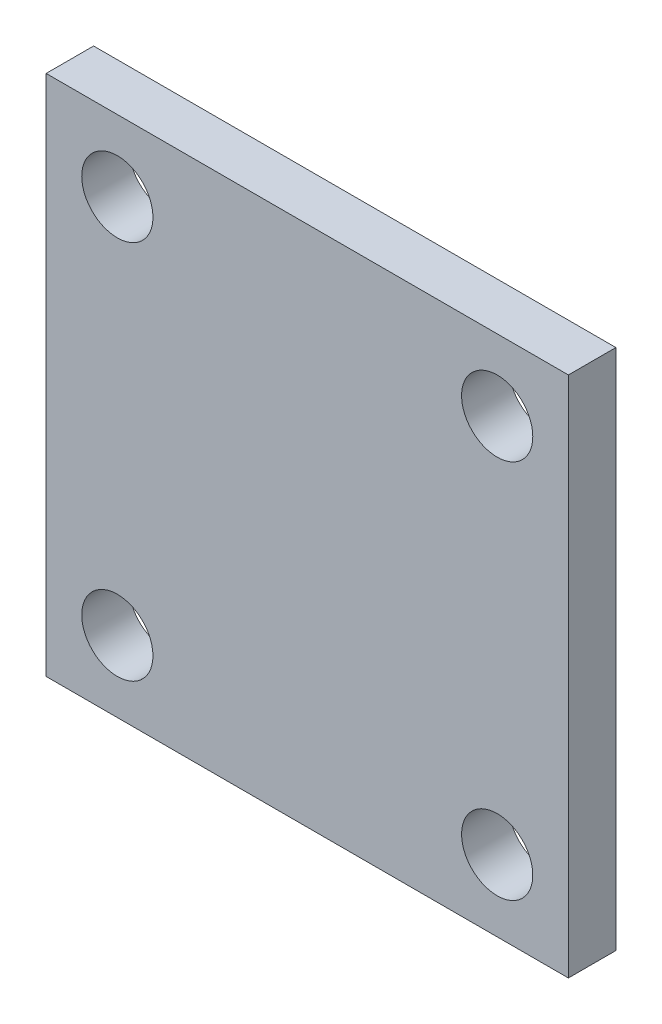
ISO-10303-21;
HEADER;
FILE_DESCRIPTION(('STEP AP214'),'2;1');
FILE_NAME('part.step','',(''),(''),'','','');
FILE_SCHEMA(('AUTOMOTIVE_DESIGN { 1 0 10303 214 1 1 1 1 }'));
ENDSEC;
DATA;
#1=APPLICATION_CONTEXT('core data for automotive mechanical design processes');
#2=APPLICATION_PROTOCOL_DEFINITION('international standard','automotive_design',2000,#1);
#3=PRODUCT_CONTEXT('',#1,'mechanical');
#4=PRODUCT('Part','Part','',(#3));
#5=PRODUCT_RELATED_PRODUCT_CATEGORY('part','',(#4));
#6=PRODUCT_DEFINITION_FORMATION('','',#4);
#7=PRODUCT_DEFINITION_CONTEXT('part definition',#1,'design');
#8=PRODUCT_DEFINITION('design','',#6,#7);
#9=PRODUCT_DEFINITION_SHAPE('','',#8);
#10=(LENGTH_UNIT() NAMED_UNIT(*) SI_UNIT(.MILLI.,.METRE.));
#11=(NAMED_UNIT(*) PLANE_ANGLE_UNIT() SI_UNIT($,.RADIAN.));
#12=(NAMED_UNIT(*) SI_UNIT($,.STERADIAN.) SOLID_ANGLE_UNIT());
#13=UNCERTAINTY_MEASURE_WITH_UNIT(LENGTH_MEASURE(1.E-05),#10,'distance_accuracy_value','');
#14=(GEOMETRIC_REPRESENTATION_CONTEXT(3) GLOBAL_UNCERTAINTY_ASSIGNED_CONTEXT((#13)) GLOBAL_UNIT_ASSIGNED_CONTEXT((#10,
#11,#12)) REPRESENTATION_CONTEXT('',''));
#15=CARTESIAN_POINT('',(0.,0.,0.));
#16=DIRECTION('',(0.,0.,1.));
#17=DIRECTION('',(1.,0.,0.));
#18=AXIS2_PLACEMENT_3D('',#15,#16,#17);
#19=CARTESIAN_POINT('',(0.,0.,2.));
#20=DIRECTION('',(0.,0.,-1.));
#21=DIRECTION('',(-1.,0.,0.));
#22=AXIS2_PLACEMENT_3D('',#19,#20,#21);
#23=PLANE('',#22);
#24=DIRECTION('',(0.,1.,0.));
#25=VECTOR('',#24,1.);
#26=CARTESIAN_POINT('',(11.,-11.,2.));
#27=LINE('',#26,#25);
#28=CARTESIAN_POINT('',(11.,-11.,2.));
#29=VERTEX_POINT('',#28);
#30=CARTESIAN_POINT('',(11.,11.,2.));
#31=VERTEX_POINT('',#30);
#32=EDGE_CURVE('E84',#29,#31,#27,.T.);
#33=ORIENTED_EDGE('',*,*,#32,.T.);
#34=DIRECTION('',(-1.,0.,0.));
#35=VECTOR('',#34,1.);
#36=CARTESIAN_POINT('',(-11.,11.,2.));
#37=LINE('',#36,#35);
#38=CARTESIAN_POINT('',(-11.,11.,2.));
#39=VERTEX_POINT('',#38);
#40=EDGE_CURVE('E79',#31,#39,#37,.T.);
#41=ORIENTED_EDGE('',*,*,#40,.T.);
#42=DIRECTION('',(0.,-1.,0.));
#43=VECTOR('',#42,1.);
#44=CARTESIAN_POINT('',(-11.,-11.,2.));
#45=LINE('',#44,#43);
#46=CARTESIAN_POINT('',(-11.,-11.,2.));
#47=VERTEX_POINT('',#46);
#48=EDGE_CURVE('E82',#39,#47,#45,.T.);
#49=ORIENTED_EDGE('',*,*,#48,.T.);
#50=DIRECTION('',(1.,0.,0.));
#51=VECTOR('',#50,1.);
#52=CARTESIAN_POINT('',(-11.,-11.,2.));
#53=LINE('',#52,#51);
#54=EDGE_CURVE('E49',#47,#29,#53,.T.);
#55=ORIENTED_EDGE('',*,*,#54,.T.);
#56=EDGE_LOOP('',(#33,#41,#49,#55));
#57=FACE_BOUND('',#56,.T.);
#58=CARTESIAN_POINT('',(8.,8.,2.));
#59=DIRECTION('',(0.,0.,1.));
#60=DIRECTION('',(1.,0.,0.));
#61=AXIS2_PLACEMENT_3D('',#58,#59,#60);
#62=CIRCLE('',#61,1.5);
#63=CARTESIAN_POINT('',(9.5,8.,2.));
#64=VERTEX_POINT('',#63);
#65=EDGE_CURVE('E99',#64,#64,#62,.T.);
#66=ORIENTED_EDGE('',*,*,#65,.F.);
#67=EDGE_LOOP('',(#66));
#68=FACE_BOUND('',#67,.T.);
#69=CARTESIAN_POINT('',(8.,-8.,2.));
#70=DIRECTION('',(0.,0.,1.));
#71=DIRECTION('',(-1.,0.,0.));
#72=AXIS2_PLACEMENT_3D('',#69,#70,#71);
#73=CIRCLE('',#72,1.5);
#74=CARTESIAN_POINT('',(6.5,-8.,2.));
#75=VERTEX_POINT('',#74);
#76=EDGE_CURVE('E114',#75,#75,#73,.T.);
#77=ORIENTED_EDGE('',*,*,#76,.F.);
#78=EDGE_LOOP('',(#77));
#79=FACE_BOUND('',#78,.T.);
#80=CARTESIAN_POINT('',(-8.,-8.,2.));
#81=DIRECTION('',(0.,0.,1.));
#82=DIRECTION('',(1.,0.,0.));
#83=AXIS2_PLACEMENT_3D('',#80,#81,#82);
#84=CIRCLE('',#83,1.5);
#85=CARTESIAN_POINT('',(-6.5,-8.,2.));
#86=VERTEX_POINT('',#85);
#87=EDGE_CURVE('E120',#86,#86,#84,.T.);
#88=ORIENTED_EDGE('',*,*,#87,.F.);
#89=EDGE_LOOP('',(#88));
#90=FACE_BOUND('',#89,.T.);
#91=CARTESIAN_POINT('',(-8.,8.,2.));
#92=DIRECTION('',(0.,0.,1.));
#93=DIRECTION('',(-1.,0.,0.));
#94=AXIS2_PLACEMENT_3D('',#91,#92,#93);
#95=CIRCLE('',#94,1.5);
#96=CARTESIAN_POINT('',(-9.5,8.,2.));
#97=VERTEX_POINT('',#96);
#98=EDGE_CURVE('E126',#97,#97,#95,.T.);
#99=ORIENTED_EDGE('',*,*,#98,.F.);
#100=EDGE_LOOP('',(#99));
#101=FACE_BOUND('',#100,.T.);
#102=ADVANCED_FACE('F32',(#57,#68,#79,#90,#101),#23,.F.);
#103=CARTESIAN_POINT('',(0.,0.,0.));
#104=DIRECTION('',(0.,0.,-1.));
#105=DIRECTION('',(-1.,0.,0.));
#106=AXIS2_PLACEMENT_3D('',#103,#104,#105);
#107=PLANE('',#106);
#108=CARTESIAN_POINT('',(-8.,-8.,0.));
#109=DIRECTION('',(0.,0.,1.));
#110=DIRECTION('',(1.,0.,0.));
#111=AXIS2_PLACEMENT_3D('',#108,#109,#110);
#112=CIRCLE('',#111,1.5);
#113=CARTESIAN_POINT('',(-6.5,-8.,0.));
#114=VERTEX_POINT('',#113);
#115=EDGE_CURVE('E123',#114,#114,#112,.T.);
#116=ORIENTED_EDGE('',*,*,#115,.T.);
#117=EDGE_LOOP('',(#116));
#118=FACE_BOUND('',#117,.T.);
#119=CARTESIAN_POINT('',(8.,8.,0.));
#120=DIRECTION('',(0.,0.,1.));
#121=DIRECTION('',(1.,0.,0.));
#122=AXIS2_PLACEMENT_3D('',#119,#120,#121);
#123=CIRCLE('',#122,1.5);
#124=CARTESIAN_POINT('',(9.5,8.,0.));
#125=VERTEX_POINT('',#124);
#126=EDGE_CURVE('E111',#125,#125,#123,.T.);
#127=ORIENTED_EDGE('',*,*,#126,.T.);
#128=EDGE_LOOP('',(#127));
#129=FACE_BOUND('',#128,.T.);
#130=DIRECTION('',(0.,1.,0.));
#131=VECTOR('',#130,1.);
#132=CARTESIAN_POINT('',(11.,-11.,0.));
#133=LINE('',#132,#131);
#134=CARTESIAN_POINT('',(11.,-11.,0.));
#135=VERTEX_POINT('',#134);
#136=CARTESIAN_POINT('',(11.,11.,0.));
#137=VERTEX_POINT('',#136);
#138=EDGE_CURVE('E96',#135,#137,#133,.T.);
#139=ORIENTED_EDGE('',*,*,#138,.F.);
#140=DIRECTION('',(1.,0.,0.));
#141=VECTOR('',#140,1.);
#142=CARTESIAN_POINT('',(-11.,-11.,0.));
#143=LINE('',#142,#141);
#144=CARTESIAN_POINT('',(-11.,-11.,0.));
#145=VERTEX_POINT('',#144);
#146=EDGE_CURVE('E72',#145,#135,#143,.T.);
#147=ORIENTED_EDGE('',*,*,#146,.F.);
#148=DIRECTION('',(0.,-1.,0.));
#149=VECTOR('',#148,1.);
#150=CARTESIAN_POINT('',(-11.,-11.,0.));
#151=LINE('',#150,#149);
#152=CARTESIAN_POINT('',(-11.,11.,0.));
#153=VERTEX_POINT('',#152);
#154=EDGE_CURVE('E66',#153,#145,#151,.T.);
#155=ORIENTED_EDGE('',*,*,#154,.F.);
#156=DIRECTION('',(-1.,0.,0.));
#157=VECTOR('',#156,1.);
#158=CARTESIAN_POINT('',(-11.,11.,0.));
#159=LINE('',#158,#157);
#160=EDGE_CURVE('E88',#137,#153,#159,.T.);
#161=ORIENTED_EDGE('',*,*,#160,.F.);
#162=EDGE_LOOP('',(#139,#147,#155,#161));
#163=FACE_BOUND('',#162,.T.);
#164=CARTESIAN_POINT('',(8.,-8.,0.));
#165=DIRECTION('',(0.,0.,1.));
#166=DIRECTION('',(-1.,0.,0.));
#167=AXIS2_PLACEMENT_3D('',#164,#165,#166);
#168=CIRCLE('',#167,1.5);
#169=CARTESIAN_POINT('',(6.5,-8.,0.));
#170=VERTEX_POINT('',#169);
#171=EDGE_CURVE('E117',#170,#170,#168,.T.);
#172=ORIENTED_EDGE('',*,*,#171,.T.);
#173=EDGE_LOOP('',(#172));
#174=FACE_BOUND('',#173,.T.);
#175=CARTESIAN_POINT('',(-8.,8.,0.));
#176=DIRECTION('',(0.,0.,1.));
#177=DIRECTION('',(-1.,0.,0.));
#178=AXIS2_PLACEMENT_3D('',#175,#176,#177);
#179=CIRCLE('',#178,1.5);
#180=CARTESIAN_POINT('',(-9.5,8.,0.));
#181=VERTEX_POINT('',#180);
#182=EDGE_CURVE('E129',#181,#181,#179,.T.);
#183=ORIENTED_EDGE('',*,*,#182,.T.);
#184=EDGE_LOOP('',(#183));
#185=FACE_BOUND('',#184,.T.);
#186=ADVANCED_FACE('F107',(#118,#129,#163,#174,#185),#107,.T.);
#187=CARTESIAN_POINT('',(11.,-11.,2.));
#188=DIRECTION('',(-1.,0.,0.));
#189=DIRECTION('',(0.,0.,1.));
#190=AXIS2_PLACEMENT_3D('',#187,#188,#189);
#191=PLANE('',#190);
#192=ORIENTED_EDGE('',*,*,#138,.T.);
#193=DIRECTION('',(0.,0.,-1.));
#194=VECTOR('',#193,1.);
#195=CARTESIAN_POINT('',(11.,11.,2.));
#196=LINE('',#195,#194);
#197=EDGE_CURVE('E11',#31,#137,#196,.T.);
#198=ORIENTED_EDGE('',*,*,#197,.F.);
#199=ORIENTED_EDGE('',*,*,#32,.F.);
#200=DIRECTION('',(0.,0.,-1.));
#201=VECTOR('',#200,1.);
#202=CARTESIAN_POINT('',(11.,-11.,2.));
#203=LINE('',#202,#201);
#204=EDGE_CURVE('E92',#29,#135,#203,.T.);
#205=ORIENTED_EDGE('',*,*,#204,.T.);
#206=EDGE_LOOP('',(#192,#198,#199,#205));
#207=FACE_BOUND('',#206,.T.);
#208=ADVANCED_FACE('F34',(#207),#191,.F.);
#209=CARTESIAN_POINT('',(-11.,11.,2.));
#210=DIRECTION('',(0.,-1.,0.));
#211=DIRECTION('',(0.,0.,-1.));
#212=AXIS2_PLACEMENT_3D('',#209,#210,#211);
#213=PLANE('',#212);
#214=ORIENTED_EDGE('',*,*,#160,.T.);
#215=DIRECTION('',(0.,0.,-1.));
#216=VECTOR('',#215,1.);
#217=CARTESIAN_POINT('',(-11.,11.,2.));
#218=LINE('',#217,#216);
#219=EDGE_CURVE('E41',#39,#153,#218,.T.);
#220=ORIENTED_EDGE('',*,*,#219,.F.);
#221=ORIENTED_EDGE('',*,*,#40,.F.);
#222=ORIENTED_EDGE('',*,*,#197,.T.);
#223=EDGE_LOOP('',(#214,#220,#221,#222));
#224=FACE_BOUND('',#223,.T.);
#225=ADVANCED_FACE('F87',(#224),#213,.F.);
#226=CARTESIAN_POINT('',(-11.,-11.,2.));
#227=DIRECTION('',(1.,0.,0.));
#228=DIRECTION('',(0.,0.,-1.));
#229=AXIS2_PLACEMENT_3D('',#226,#227,#228);
#230=PLANE('',#229);
#231=ORIENTED_EDGE('',*,*,#154,.T.);
#232=DIRECTION('',(0.,0.,-1.));
#233=VECTOR('',#232,1.);
#234=CARTESIAN_POINT('',(-11.,-11.,2.));
#235=LINE('',#234,#233);
#236=EDGE_CURVE('E89',#47,#145,#235,.T.);
#237=ORIENTED_EDGE('',*,*,#236,.F.);
#238=ORIENTED_EDGE('',*,*,#48,.F.);
#239=ORIENTED_EDGE('',*,*,#219,.T.);
#240=EDGE_LOOP('',(#231,#237,#238,#239));
#241=FACE_BOUND('',#240,.T.);
#242=ADVANCED_FACE('F90',(#241),#230,.F.);
#243=CARTESIAN_POINT('',(-11.,-11.,2.));
#244=DIRECTION('',(0.,1.,0.));
#245=DIRECTION('',(0.,0.,1.));
#246=AXIS2_PLACEMENT_3D('',#243,#244,#245);
#247=PLANE('',#246);
#248=ORIENTED_EDGE('',*,*,#146,.T.);
#249=ORIENTED_EDGE('',*,*,#204,.F.);
#250=ORIENTED_EDGE('',*,*,#54,.F.);
#251=ORIENTED_EDGE('',*,*,#236,.T.);
#252=EDGE_LOOP('',(#248,#249,#250,#251));
#253=FACE_BOUND('',#252,.T.);
#254=ADVANCED_FACE('F104',(#253),#247,.F.);
#255=CARTESIAN_POINT('',(8.,8.,2.));
#256=DIRECTION('',(0.,0.,-1.));
#257=DIRECTION('',(-1.,0.,0.));
#258=AXIS2_PLACEMENT_3D('',#255,#256,#257);
#259=CYLINDRICAL_SURFACE('',#258,1.5);
#260=ORIENTED_EDGE('',*,*,#65,.T.);
#261=EDGE_LOOP('',(#260));
#262=FACE_BOUND('',#261,.T.);
#263=ORIENTED_EDGE('',*,*,#126,.F.);
#264=EDGE_LOOP('',(#263));
#265=FACE_BOUND('',#264,.T.);
#266=ADVANCED_FACE('F146',(#262,#265),#259,.F.);
#267=CARTESIAN_POINT('',(8.,-8.,2.));
#268=DIRECTION('',(0.,0.,-1.));
#269=DIRECTION('',(-1.,0.,0.));
#270=AXIS2_PLACEMENT_3D('',#267,#268,#269);
#271=CYLINDRICAL_SURFACE('',#270,1.5);
#272=ORIENTED_EDGE('',*,*,#76,.T.);
#273=EDGE_LOOP('',(#272));
#274=FACE_BOUND('',#273,.T.);
#275=ORIENTED_EDGE('',*,*,#171,.F.);
#276=EDGE_LOOP('',(#275));
#277=FACE_BOUND('',#276,.T.);
#278=ADVANCED_FACE('F192',(#274,#277),#271,.F.);
#279=CARTESIAN_POINT('',(-8.,-8.,2.));
#280=DIRECTION('',(0.,0.,-1.));
#281=DIRECTION('',(-1.,0.,0.));
#282=AXIS2_PLACEMENT_3D('',#279,#280,#281);
#283=CYLINDRICAL_SURFACE('',#282,1.5);
#284=ORIENTED_EDGE('',*,*,#87,.T.);
#285=EDGE_LOOP('',(#284));
#286=FACE_BOUND('',#285,.T.);
#287=ORIENTED_EDGE('',*,*,#115,.F.);
#288=EDGE_LOOP('',(#287));
#289=FACE_BOUND('',#288,.T.);
#290=ADVANCED_FACE('F200',(#286,#289),#283,.F.);
#291=CARTESIAN_POINT('',(-8.,8.,2.));
#292=DIRECTION('',(0.,0.,-1.));
#293=DIRECTION('',(-1.,0.,0.));
#294=AXIS2_PLACEMENT_3D('',#291,#292,#293);
#295=CYLINDRICAL_SURFACE('',#294,1.5);
#296=ORIENTED_EDGE('',*,*,#98,.T.);
#297=EDGE_LOOP('',(#296));
#298=FACE_BOUND('',#297,.T.);
#299=ORIENTED_EDGE('',*,*,#182,.F.);
#300=EDGE_LOOP('',(#299));
#301=FACE_BOUND('',#300,.T.);
#302=ADVANCED_FACE('F135',(#298,#301),#295,.F.);
#303=CLOSED_SHELL('',(#102,#186,#208,#225,#242,#254,#266,#278,#290,#302));
#304=MANIFOLD_SOLID_BREP('B2',#303);
#305=ADVANCED_BREP_SHAPE_REPRESENTATION('',(#18,#304),#14);
#306=SHAPE_DEFINITION_REPRESENTATION(#9,#305);
ENDSEC;
END-ISO-10303-21;
